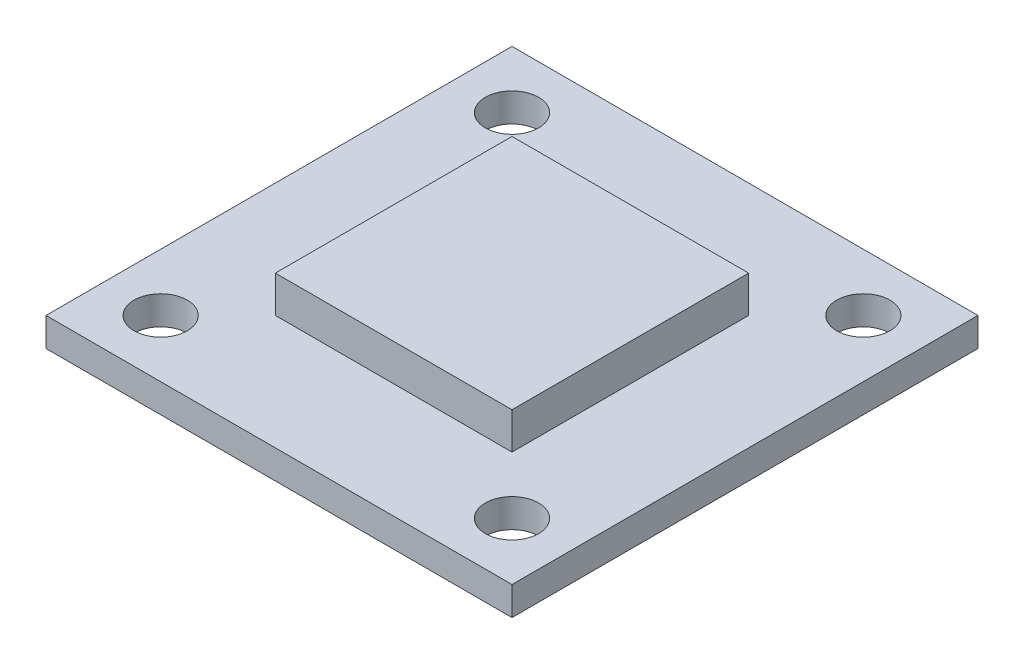
ISO-10303-21;
HEADER;
FILE_DESCRIPTION(('STEP AP214'),'2;1');
FILE_NAME('part.step','',(''),(''),'','','');
FILE_SCHEMA(('AUTOMOTIVE_DESIGN { 1 0 10303 214 1 1 1 1 }'));
ENDSEC;
DATA;
#1=APPLICATION_CONTEXT('core data for automotive mechanical design processes');
#2=APPLICATION_PROTOCOL_DEFINITION('international standard','automotive_design',2000,#1);
#3=PRODUCT_CONTEXT('',#1,'mechanical');
#4=PRODUCT('Part','Part','',(#3));
#5=PRODUCT_RELATED_PRODUCT_CATEGORY('part','',(#4));
#6=PRODUCT_DEFINITION_FORMATION('','',#4);
#7=PRODUCT_DEFINITION_CONTEXT('part definition',#1,'design');
#8=PRODUCT_DEFINITION('design','',#6,#7);
#9=PRODUCT_DEFINITION_SHAPE('','',#8);
#10=(LENGTH_UNIT() NAMED_UNIT(*) SI_UNIT(.MILLI.,.METRE.));
#11=(NAMED_UNIT(*) PLANE_ANGLE_UNIT() SI_UNIT($,.RADIAN.));
#12=(NAMED_UNIT(*) SI_UNIT($,.STERADIAN.) SOLID_ANGLE_UNIT());
#13=UNCERTAINTY_MEASURE_WITH_UNIT(LENGTH_MEASURE(1.E-05),#10,'distance_accuracy_value','');
#14=(GEOMETRIC_REPRESENTATION_CONTEXT(3) GLOBAL_UNCERTAINTY_ASSIGNED_CONTEXT((#13)) GLOBAL_UNIT_ASSIGNED_CONTEXT((#10,
#11,#12)) REPRESENTATION_CONTEXT('',''));
#15=CARTESIAN_POINT('',(0.,0.,0.));
#16=DIRECTION('',(0.,0.,1.));
#17=DIRECTION('',(1.,0.,0.));
#18=AXIS2_PLACEMENT_3D('',#15,#16,#17);
#19=CARTESIAN_POINT('',(0.,1.5875,0.));
#20=DIRECTION('',(0.,-1.,0.));
#21=DIRECTION('',(0.,0.,-1.));
#22=AXIS2_PLACEMENT_3D('',#19,#20,#21);
#23=PLANE('',#22);
#24=CARTESIAN_POINT('',(-9.7282,1.5875,9.7282));
#25=DIRECTION('',(0.,1.,0.));
#26=DIRECTION('',(0.,0.,1.));
#27=AXIS2_PLACEMENT_3D('',#24,#25,#26);
#28=CIRCLE('',#27,1.4732);
#29=CARTESIAN_POINT('',(-9.7282,1.5875,11.2014));
#30=VERTEX_POINT('',#29);
#31=EDGE_CURVE('E310',#30,#30,#28,.T.);
#32=ORIENTED_EDGE('',*,*,#31,.F.);
#33=EDGE_LOOP('',(#32));
#34=FACE_BOUND('',#33,.T.);
#35=CARTESIAN_POINT('',(9.7282,1.5875,9.7282));
#36=DIRECTION('',(0.,1.,0.));
#37=DIRECTION('',(0.,0.,1.));
#38=AXIS2_PLACEMENT_3D('',#35,#36,#37);
#39=CIRCLE('',#38,1.4732);
#40=CARTESIAN_POINT('',(9.7282,1.5875,11.2014));
#41=VERTEX_POINT('',#40);
#42=EDGE_CURVE('E318',#41,#41,#39,.T.);
#43=ORIENTED_EDGE('',*,*,#42,.F.);
#44=EDGE_LOOP('',(#43));
#45=FACE_BOUND('',#44,.T.);
#46=CARTESIAN_POINT('',(9.7282,1.5875,-9.7282));
#47=DIRECTION('',(0.,1.,0.));
#48=DIRECTION('',(0.,0.,1.));
#49=AXIS2_PLACEMENT_3D('',#46,#47,#48);
#50=CIRCLE('',#49,1.4732);
#51=CARTESIAN_POINT('',(9.7282,1.5875,-8.255));
#52=VERTEX_POINT('',#51);
#53=EDGE_CURVE('E324',#52,#52,#50,.T.);
#54=ORIENTED_EDGE('',*,*,#53,.F.);
#55=EDGE_LOOP('',(#54));
#56=FACE_BOUND('',#55,.T.);
#57=DIRECTION('',(0.,0.,-1.));
#58=VECTOR('',#57,1.);
#59=CARTESIAN_POINT('',(12.9032,1.5875,12.9032));
#60=LINE('',#59,#58);
#61=CARTESIAN_POINT('',(12.9032,1.5875,12.9032));
#62=VERTEX_POINT('',#61);
#63=CARTESIAN_POINT('',(12.9032,1.5875,-12.9032));
#64=VERTEX_POINT('',#63);
#65=EDGE_CURVE('E127',#62,#64,#60,.T.);
#66=ORIENTED_EDGE('',*,*,#65,.T.);
#67=DIRECTION('',(-1.,0.,0.));
#68=VECTOR('',#67,1.);
#69=CARTESIAN_POINT('',(-12.9032,1.5875,-12.9032));
#70=LINE('',#69,#68);
#71=CARTESIAN_POINT('',(-12.9032,1.5875,-12.9032));
#72=VERTEX_POINT('',#71);
#73=EDGE_CURVE('E130',#64,#72,#70,.T.);
#74=ORIENTED_EDGE('',*,*,#73,.T.);
#75=DIRECTION('',(0.,0.,1.));
#76=VECTOR('',#75,1.);
#77=CARTESIAN_POINT('',(-12.9032,1.5875,12.9032));
#78=LINE('',#77,#76);
#79=CARTESIAN_POINT('',(-12.9032,1.5875,12.9032));
#80=VERTEX_POINT('',#79);
#81=EDGE_CURVE('E133',#72,#80,#78,.T.);
#82=ORIENTED_EDGE('',*,*,#81,.T.);
#83=DIRECTION('',(1.,0.,0.));
#84=VECTOR('',#83,1.);
#85=CARTESIAN_POINT('',(-12.9032,1.5875,12.9032));
#86=LINE('',#85,#84);
#87=EDGE_CURVE('E135',#80,#62,#86,.T.);
#88=ORIENTED_EDGE('',*,*,#87,.T.);
#89=EDGE_LOOP('',(#66,#74,#82,#88));
#90=FACE_BOUND('',#89,.T.);
#91=DIRECTION('',(0.,0.,-1.));
#92=VECTOR('',#91,1.);
#93=CARTESIAN_POINT('',(6.5532,1.5875,6.5532));
#94=LINE('',#93,#92);
#95=CARTESIAN_POINT('',(6.5532,1.5875,6.5532));
#96=VERTEX_POINT('',#95);
#97=CARTESIAN_POINT('',(6.5532,1.5875,-6.5532));
#98=VERTEX_POINT('',#97);
#99=EDGE_CURVE('E48',#96,#98,#94,.T.);
#100=ORIENTED_EDGE('',*,*,#99,.F.);
#101=DIRECTION('',(1.,0.,0.));
#102=VECTOR('',#101,1.);
#103=CARTESIAN_POINT('',(-6.5532,1.5875,6.5532));
#104=LINE('',#103,#102);
#105=CARTESIAN_POINT('',(-6.5532,1.5875,6.5532));
#106=VERTEX_POINT('',#105);
#107=EDGE_CURVE('E52',#106,#96,#104,.T.);
#108=ORIENTED_EDGE('',*,*,#107,.F.);
#109=DIRECTION('',(0.,0.,1.));
#110=VECTOR('',#109,1.);
#111=CARTESIAN_POINT('',(-6.5532,1.5875,6.5532));
#112=LINE('',#111,#110);
#113=CARTESIAN_POINT('',(-6.5532,1.5875,-6.5532));
#114=VERTEX_POINT('',#113);
#115=EDGE_CURVE('E336',#114,#106,#112,.T.);
#116=ORIENTED_EDGE('',*,*,#115,.F.);
#117=DIRECTION('',(-1.,0.,0.));
#118=VECTOR('',#117,1.);
#119=CARTESIAN_POINT('',(-6.5532,1.5875,-6.5532));
#120=LINE('',#119,#118);
#121=EDGE_CURVE('E334',#98,#114,#120,.T.);
#122=ORIENTED_EDGE('',*,*,#121,.F.);
#123=EDGE_LOOP('',(#100,#108,#116,#122));
#124=FACE_BOUND('',#123,.T.);
#125=CARTESIAN_POINT('',(-9.7282,1.5875,-9.7282));
#126=DIRECTION('',(0.,1.,0.));
#127=DIRECTION('',(0.,0.,1.));
#128=AXIS2_PLACEMENT_3D('',#125,#126,#127);
#129=CIRCLE('',#128,1.4732);
#130=CARTESIAN_POINT('',(-9.7282,1.5875,-8.255));
#131=VERTEX_POINT('',#130);
#132=EDGE_CURVE('E307',#131,#131,#129,.T.);
#133=ORIENTED_EDGE('',*,*,#132,.F.);
#134=EDGE_LOOP('',(#133));
#135=FACE_BOUND('',#134,.T.);
#136=ADVANCED_FACE('F33',(#34,#45,#56,#90,#124,#135),#23,.F.);
#137=CARTESIAN_POINT('',(12.9032,1.5875,12.9032));
#138=DIRECTION('',(-1.,0.,0.));
#139=DIRECTION('',(0.,0.,1.));
#140=AXIS2_PLACEMENT_3D('',#137,#138,#139);
#141=PLANE('',#140);
#142=DIRECTION('',(0.,0.,-1.));
#143=VECTOR('',#142,1.);
#144=CARTESIAN_POINT('',(12.9032,0.,12.9032));
#145=LINE('',#144,#143);
#146=CARTESIAN_POINT('',(12.9032,0.,12.9032));
#147=VERTEX_POINT('',#146);
#148=CARTESIAN_POINT('',(12.9032,0.,-12.9032));
#149=VERTEX_POINT('',#148);
#150=EDGE_CURVE('E118',#147,#149,#145,.T.);
#151=ORIENTED_EDGE('',*,*,#150,.T.);
#152=DIRECTION('',(0.,-1.,0.));
#153=VECTOR('',#152,1.);
#154=CARTESIAN_POINT('',(12.9032,1.5875,-12.9032));
#155=LINE('',#154,#153);
#156=EDGE_CURVE('E11',#64,#149,#155,.T.);
#157=ORIENTED_EDGE('',*,*,#156,.F.);
#158=ORIENTED_EDGE('',*,*,#65,.F.);
#159=DIRECTION('',(0.,-1.,0.));
#160=VECTOR('',#159,1.);
#161=CARTESIAN_POINT('',(12.9032,1.5875,12.9032));
#162=LINE('',#161,#160);
#163=EDGE_CURVE('E136',#62,#147,#162,.T.);
#164=ORIENTED_EDGE('',*,*,#163,.T.);
#165=EDGE_LOOP('',(#151,#157,#158,#164));
#166=FACE_BOUND('',#165,.T.);
#167=ADVANCED_FACE('F35',(#166),#141,.F.);
#168=CARTESIAN_POINT('',(-12.9032,1.5875,-12.9032));
#169=DIRECTION('',(0.,0.,1.));
#170=DIRECTION('',(1.,0.,0.));
#171=AXIS2_PLACEMENT_3D('',#168,#169,#170);
#172=PLANE('',#171);
#173=DIRECTION('',(-1.,0.,0.));
#174=VECTOR('',#173,1.);
#175=CARTESIAN_POINT('',(-12.9032,0.,-12.9032));
#176=LINE('',#175,#174);
#177=CARTESIAN_POINT('',(-12.9032,0.,-12.9032));
#178=VERTEX_POINT('',#177);
#179=EDGE_CURVE('E121',#149,#178,#176,.T.);
#180=ORIENTED_EDGE('',*,*,#179,.T.);
#181=DIRECTION('',(0.,-1.,0.));
#182=VECTOR('',#181,1.);
#183=CARTESIAN_POINT('',(-12.9032,1.5875,-12.9032));
#184=LINE('',#183,#182);
#185=EDGE_CURVE('E41',#72,#178,#184,.T.);
#186=ORIENTED_EDGE('',*,*,#185,.F.);
#187=ORIENTED_EDGE('',*,*,#73,.F.);
#188=ORIENTED_EDGE('',*,*,#156,.T.);
#189=EDGE_LOOP('',(#180,#186,#187,#188));
#190=FACE_BOUND('',#189,.T.);
#191=ADVANCED_FACE('F166',(#190),#172,.F.);
#192=CARTESIAN_POINT('',(-12.9032,1.5875,12.9032));
#193=DIRECTION('',(1.,0.,0.));
#194=DIRECTION('',(0.,0.,-1.));
#195=AXIS2_PLACEMENT_3D('',#192,#193,#194);
#196=PLANE('',#195);
#197=DIRECTION('',(0.,0.,1.));
#198=VECTOR('',#197,1.);
#199=CARTESIAN_POINT('',(-12.9032,0.,12.9032));
#200=LINE('',#199,#198);
#201=CARTESIAN_POINT('',(-12.9032,0.,12.9032));
#202=VERTEX_POINT('',#201);
#203=EDGE_CURVE('E139',#178,#202,#200,.T.);
#204=ORIENTED_EDGE('',*,*,#203,.T.);
#205=DIRECTION('',(0.,-1.,0.));
#206=VECTOR('',#205,1.);
#207=CARTESIAN_POINT('',(-12.9032,1.5875,12.9032));
#208=LINE('',#207,#206);
#209=EDGE_CURVE('E144',#80,#202,#208,.T.);
#210=ORIENTED_EDGE('',*,*,#209,.F.);
#211=ORIENTED_EDGE('',*,*,#81,.F.);
#212=ORIENTED_EDGE('',*,*,#185,.T.);
#213=EDGE_LOOP('',(#204,#210,#211,#212));
#214=FACE_BOUND('',#213,.T.);
#215=ADVANCED_FACE('F151',(#214),#196,.F.);
#216=CARTESIAN_POINT('',(-12.9032,1.5875,12.9032));
#217=DIRECTION('',(0.,0.,-1.));
#218=DIRECTION('',(-1.,0.,0.));
#219=AXIS2_PLACEMENT_3D('',#216,#217,#218);
#220=PLANE('',#219);
#221=DIRECTION('',(1.,0.,0.));
#222=VECTOR('',#221,1.);
#223=CARTESIAN_POINT('',(-12.9032,0.,12.9032));
#224=LINE('',#223,#222);
#225=EDGE_CURVE('E131',#202,#147,#224,.T.);
#226=ORIENTED_EDGE('',*,*,#225,.T.);
#227=ORIENTED_EDGE('',*,*,#163,.F.);
#228=ORIENTED_EDGE('',*,*,#87,.F.);
#229=ORIENTED_EDGE('',*,*,#209,.T.);
#230=EDGE_LOOP('',(#226,#227,#228,#229));
#231=FACE_BOUND('',#230,.T.);
#232=ADVANCED_FACE('F160',(#231),#220,.F.);
#233=CARTESIAN_POINT('',(0.,0.,0.));
#234=DIRECTION('',(0.,-1.,0.));
#235=DIRECTION('',(0.,0.,-1.));
#236=AXIS2_PLACEMENT_3D('',#233,#234,#235);
#237=PLANE('',#236);
#238=CARTESIAN_POINT('',(-9.7282,0.,-9.7282));
#239=DIRECTION('',(0.,1.,0.));
#240=DIRECTION('',(0.,0.,1.));
#241=AXIS2_PLACEMENT_3D('',#238,#239,#240);
#242=CIRCLE('',#241,1.4732);
#243=CARTESIAN_POINT('',(-9.7282,0.,-8.255));
#244=VERTEX_POINT('',#243);
#245=EDGE_CURVE('E304',#244,#244,#242,.T.);
#246=ORIENTED_EDGE('',*,*,#245,.T.);
#247=EDGE_LOOP('',(#246));
#248=FACE_BOUND('',#247,.T.);
#249=CARTESIAN_POINT('',(-9.7282,0.,9.7282));
#250=DIRECTION('',(0.,1.,0.));
#251=DIRECTION('',(0.,0.,1.));
#252=AXIS2_PLACEMENT_3D('',#249,#250,#251);
#253=CIRCLE('',#252,1.4732);
#254=CARTESIAN_POINT('',(-9.7282,0.,11.2014));
#255=VERTEX_POINT('',#254);
#256=EDGE_CURVE('E315',#255,#255,#253,.T.);
#257=ORIENTED_EDGE('',*,*,#256,.T.);
#258=EDGE_LOOP('',(#257));
#259=FACE_BOUND('',#258,.T.);
#260=CARTESIAN_POINT('',(9.7282,0.,9.7282));
#261=DIRECTION('',(0.,1.,0.));
#262=DIRECTION('',(0.,0.,1.));
#263=AXIS2_PLACEMENT_3D('',#260,#261,#262);
#264=CIRCLE('',#263,1.4732);
#265=CARTESIAN_POINT('',(9.7282,0.,11.2014));
#266=VERTEX_POINT('',#265);
#267=EDGE_CURVE('E321',#266,#266,#264,.T.);
#268=ORIENTED_EDGE('',*,*,#267,.T.);
#269=EDGE_LOOP('',(#268));
#270=FACE_BOUND('',#269,.T.);
#271=CARTESIAN_POINT('',(9.7282,0.,-9.7282));
#272=DIRECTION('',(0.,1.,0.));
#273=DIRECTION('',(0.,0.,1.));
#274=AXIS2_PLACEMENT_3D('',#271,#272,#273);
#275=CIRCLE('',#274,1.4732);
#276=CARTESIAN_POINT('',(9.7282,0.,-8.255));
#277=VERTEX_POINT('',#276);
#278=EDGE_CURVE('E327',#277,#277,#275,.T.);
#279=ORIENTED_EDGE('',*,*,#278,.T.);
#280=EDGE_LOOP('',(#279));
#281=FACE_BOUND('',#280,.T.);
#282=ORIENTED_EDGE('',*,*,#150,.F.);
#283=ORIENTED_EDGE('',*,*,#225,.F.);
#284=ORIENTED_EDGE('',*,*,#203,.F.);
#285=ORIENTED_EDGE('',*,*,#179,.F.);
#286=EDGE_LOOP('',(#282,#283,#284,#285));
#287=FACE_BOUND('',#286,.T.);
#288=ADVANCED_FACE('F157',(#248,#259,#270,#281,#287),#237,.T.);
#289=CARTESIAN_POINT('',(6.5532,3.6195,6.5532));
#290=DIRECTION('',(-1.,0.,0.));
#291=DIRECTION('',(0.,0.,1.));
#292=AXIS2_PLACEMENT_3D('',#289,#290,#291);
#293=PLANE('',#292);
#294=ORIENTED_EDGE('',*,*,#99,.T.);
#295=DIRECTION('',(0.,-1.,0.));
#296=VECTOR('',#295,1.);
#297=CARTESIAN_POINT('',(6.5532,3.6195,-6.5532));
#298=LINE('',#297,#296);
#299=CARTESIAN_POINT('',(6.5532,3.6195,-6.5532));
#300=VERTEX_POINT('',#299);
#301=EDGE_CURVE('E101',#300,#98,#298,.T.);
#302=ORIENTED_EDGE('',*,*,#301,.F.);
#303=DIRECTION('',(0.,0.,-1.));
#304=VECTOR('',#303,1.);
#305=CARTESIAN_POINT('',(6.5532,3.6195,6.5532));
#306=LINE('',#305,#304);
#307=CARTESIAN_POINT('',(6.5532,3.6195,6.5532));
#308=VERTEX_POINT('',#307);
#309=EDGE_CURVE('E107',#308,#300,#306,.T.);
#310=ORIENTED_EDGE('',*,*,#309,.F.);
#311=DIRECTION('',(0.,-1.,0.));
#312=VECTOR('',#311,1.);
#313=CARTESIAN_POINT('',(6.5532,3.6195,6.5532));
#314=LINE('',#313,#312);
#315=EDGE_CURVE('E332',#308,#96,#314,.T.);
#316=ORIENTED_EDGE('',*,*,#315,.T.);
#317=EDGE_LOOP('',(#294,#302,#310,#316));
#318=FACE_BOUND('',#317,.T.);
#319=ADVANCED_FACE('F117',(#318),#293,.F.);
#320=CARTESIAN_POINT('',(-6.5532,3.6195,-6.5532));
#321=DIRECTION('',(0.,0.,1.));
#322=DIRECTION('',(1.,0.,0.));
#323=AXIS2_PLACEMENT_3D('',#320,#321,#322);
#324=PLANE('',#323);
#325=ORIENTED_EDGE('',*,*,#121,.T.);
#326=DIRECTION('',(0.,-1.,0.));
#327=VECTOR('',#326,1.);
#328=CARTESIAN_POINT('',(-6.5532,3.6195,-6.5532));
#329=LINE('',#328,#327);
#330=CARTESIAN_POINT('',(-6.5532,3.6195,-6.5532));
#331=VERTEX_POINT('',#330);
#332=EDGE_CURVE('E103',#331,#114,#329,.T.);
#333=ORIENTED_EDGE('',*,*,#332,.F.);
#334=DIRECTION('',(-1.,0.,0.));
#335=VECTOR('',#334,1.);
#336=CARTESIAN_POINT('',(-6.5532,3.6195,-6.5532));
#337=LINE('',#336,#335);
#338=EDGE_CURVE('E96',#300,#331,#337,.T.);
#339=ORIENTED_EDGE('',*,*,#338,.F.);
#340=ORIENTED_EDGE('',*,*,#301,.T.);
#341=EDGE_LOOP('',(#325,#333,#339,#340));
#342=FACE_BOUND('',#341,.T.);
#343=ADVANCED_FACE('F99',(#342),#324,.F.);
#344=CARTESIAN_POINT('',(-6.5532,3.6195,6.5532));
#345=DIRECTION('',(1.,0.,0.));
#346=DIRECTION('',(0.,0.,-1.));
#347=AXIS2_PLACEMENT_3D('',#344,#345,#346);
#348=PLANE('',#347);
#349=ORIENTED_EDGE('',*,*,#115,.T.);
#350=DIRECTION('',(0.,-1.,0.));
#351=VECTOR('',#350,1.);
#352=CARTESIAN_POINT('',(-6.5532,3.6195,6.5532));
#353=LINE('',#352,#351);
#354=CARTESIAN_POINT('',(-6.5532,3.6195,6.5532));
#355=VERTEX_POINT('',#354);
#356=EDGE_CURVE('E123',#355,#106,#353,.T.);
#357=ORIENTED_EDGE('',*,*,#356,.F.);
#358=DIRECTION('',(0.,0.,1.));
#359=VECTOR('',#358,1.);
#360=CARTESIAN_POINT('',(-6.5532,3.6195,6.5532));
#361=LINE('',#360,#359);
#362=EDGE_CURVE('E106',#331,#355,#361,.T.);
#363=ORIENTED_EDGE('',*,*,#362,.F.);
#364=ORIENTED_EDGE('',*,*,#332,.T.);
#365=EDGE_LOOP('',(#349,#357,#363,#364));
#366=FACE_BOUND('',#365,.T.);
#367=ADVANCED_FACE('F207',(#366),#348,.F.);
#368=CARTESIAN_POINT('',(-6.5532,3.6195,6.5532));
#369=DIRECTION('',(0.,0.,-1.));
#370=DIRECTION('',(-1.,0.,0.));
#371=AXIS2_PLACEMENT_3D('',#368,#369,#370);
#372=PLANE('',#371);
#373=ORIENTED_EDGE('',*,*,#107,.T.);
#374=ORIENTED_EDGE('',*,*,#315,.F.);
#375=DIRECTION('',(1.,0.,0.));
#376=VECTOR('',#375,1.);
#377=CARTESIAN_POINT('',(-6.5532,3.6195,6.5532));
#378=LINE('',#377,#376);
#379=EDGE_CURVE('E112',#355,#308,#378,.T.);
#380=ORIENTED_EDGE('',*,*,#379,.F.);
#381=ORIENTED_EDGE('',*,*,#356,.T.);
#382=EDGE_LOOP('',(#373,#374,#380,#381));
#383=FACE_BOUND('',#382,.T.);
#384=ADVANCED_FACE('F213',(#383),#372,.F.);
#385=CARTESIAN_POINT('',(0.,3.6195,0.));
#386=DIRECTION('',(0.,-1.,0.));
#387=DIRECTION('',(0.,0.,-1.));
#388=AXIS2_PLACEMENT_3D('',#385,#386,#387);
#389=PLANE('',#388);
#390=ORIENTED_EDGE('',*,*,#309,.T.);
#391=ORIENTED_EDGE('',*,*,#338,.T.);
#392=ORIENTED_EDGE('',*,*,#362,.T.);
#393=ORIENTED_EDGE('',*,*,#379,.T.);
#394=EDGE_LOOP('',(#390,#391,#392,#393));
#395=FACE_BOUND('',#394,.T.);
#396=ADVANCED_FACE('F110',(#395),#389,.F.);
#397=CARTESIAN_POINT('',(9.7282,1.5875,-9.7282));
#398=DIRECTION('',(0.,1.,0.));
#399=DIRECTION('',(0.,0.,1.));
#400=AXIS2_PLACEMENT_3D('',#397,#398,#399);
#401=CYLINDRICAL_SURFACE('',#400,1.4732);
#402=ORIENTED_EDGE('',*,*,#278,.F.);
#403=EDGE_LOOP('',(#402));
#404=FACE_BOUND('',#403,.T.);
#405=ORIENTED_EDGE('',*,*,#53,.T.);
#406=EDGE_LOOP('',(#405));
#407=FACE_BOUND('',#406,.T.);
#408=ADVANCED_FACE('F228',(#404,#407),#401,.F.);
#409=CARTESIAN_POINT('',(9.7282,1.5875,9.7282));
#410=DIRECTION('',(0.,1.,0.));
#411=DIRECTION('',(0.,0.,1.));
#412=AXIS2_PLACEMENT_3D('',#409,#410,#411);
#413=CYLINDRICAL_SURFACE('',#412,1.4732);
#414=ORIENTED_EDGE('',*,*,#267,.F.);
#415=EDGE_LOOP('',(#414));
#416=FACE_BOUND('',#415,.T.);
#417=ORIENTED_EDGE('',*,*,#42,.T.);
#418=EDGE_LOOP('',(#417));
#419=FACE_BOUND('',#418,.T.);
#420=ADVANCED_FACE('F234',(#416,#419),#413,.F.);
#421=CARTESIAN_POINT('',(-9.7282,1.5875,9.7282));
#422=DIRECTION('',(0.,1.,0.));
#423=DIRECTION('',(0.,0.,1.));
#424=AXIS2_PLACEMENT_3D('',#421,#422,#423);
#425=CYLINDRICAL_SURFACE('',#424,1.4732);
#426=ORIENTED_EDGE('',*,*,#256,.F.);
#427=EDGE_LOOP('',(#426));
#428=FACE_BOUND('',#427,.T.);
#429=ORIENTED_EDGE('',*,*,#31,.T.);
#430=EDGE_LOOP('',(#429));
#431=FACE_BOUND('',#430,.T.);
#432=ADVANCED_FACE('F242',(#428,#431),#425,.F.);
#433=CARTESIAN_POINT('',(-9.7282,1.5875,-9.7282));
#434=DIRECTION('',(0.,1.,0.));
#435=DIRECTION('',(0.,0.,1.));
#436=AXIS2_PLACEMENT_3D('',#433,#434,#435);
#437=CYLINDRICAL_SURFACE('',#436,1.4732);
#438=ORIENTED_EDGE('',*,*,#245,.F.);
#439=EDGE_LOOP('',(#438));
#440=FACE_BOUND('',#439,.T.);
#441=ORIENTED_EDGE('',*,*,#132,.T.);
#442=EDGE_LOOP('',(#441));
#443=FACE_BOUND('',#442,.T.);
#444=ADVANCED_FACE('F250',(#440,#443),#437,.F.);
#445=CLOSED_SHELL('',(#136,#167,#191,#215,#232,#288,#319,#343,#367,#384,#396,#408,#420,#432,#444));
#446=MANIFOLD_SOLID_BREP('B2',#445);
#447=ADVANCED_BREP_SHAPE_REPRESENTATION('',(#18,#446),#14);
#448=SHAPE_DEFINITION_REPRESENTATION(#9,#447);
ENDSEC;
END-ISO-10303-21;
